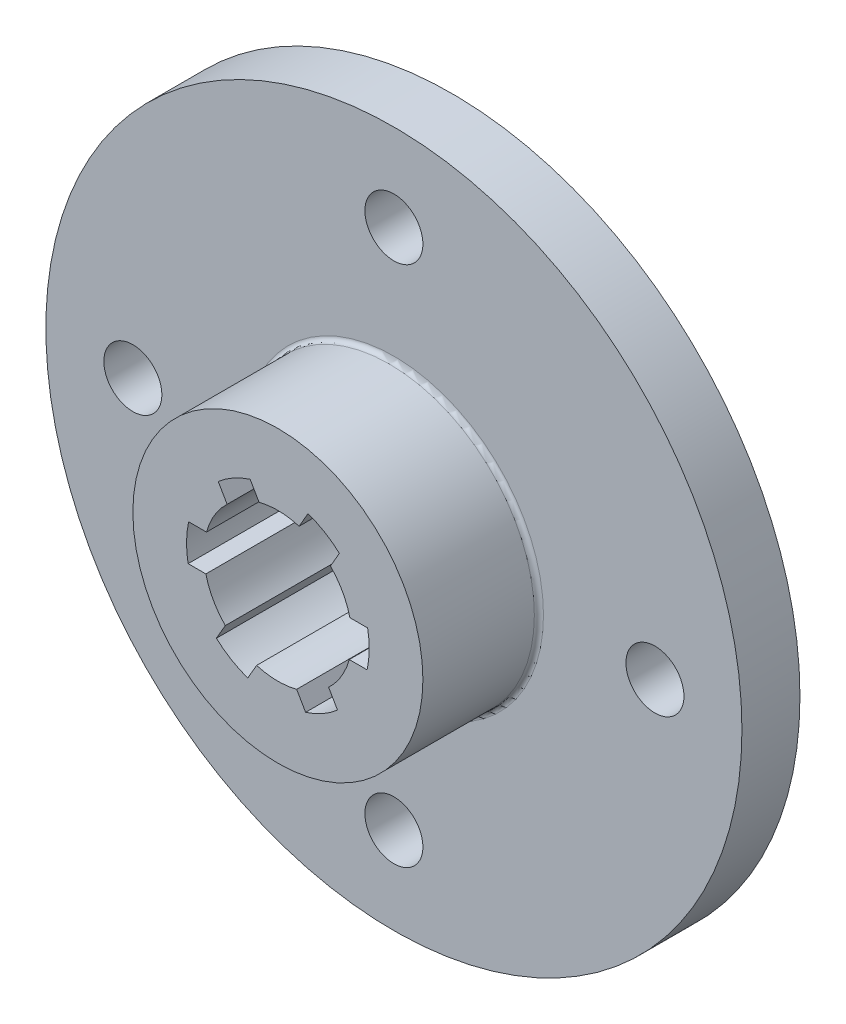
ISO-10303-21;
HEADER;
FILE_DESCRIPTION(('STEP AP214'),'2;1');
FILE_NAME('part.step','',(''),(''),'','','');
FILE_SCHEMA(('AUTOMOTIVE_DESIGN { 1 0 10303 214 1 1 1 1 }'));
ENDSEC;
DATA;
#1=APPLICATION_CONTEXT('core data for automotive mechanical design processes');
#2=APPLICATION_PROTOCOL_DEFINITION('international standard','automotive_design',2000,#1);
#3=PRODUCT_CONTEXT('',#1,'mechanical');
#4=PRODUCT('Part','Part','',(#3));
#5=PRODUCT_RELATED_PRODUCT_CATEGORY('part','',(#4));
#6=PRODUCT_DEFINITION_FORMATION('','',#4);
#7=PRODUCT_DEFINITION_CONTEXT('part definition',#1,'design');
#8=PRODUCT_DEFINITION('design','',#6,#7);
#9=PRODUCT_DEFINITION_SHAPE('','',#8);
#10=(LENGTH_UNIT() NAMED_UNIT(*) SI_UNIT(.MILLI.,.METRE.));
#11=(NAMED_UNIT(*) PLANE_ANGLE_UNIT() SI_UNIT($,.RADIAN.));
#12=(NAMED_UNIT(*) SI_UNIT($,.STERADIAN.) SOLID_ANGLE_UNIT());
#13=UNCERTAINTY_MEASURE_WITH_UNIT(LENGTH_MEASURE(1.E-05),#10,'distance_accuracy_value','');
#14=(GEOMETRIC_REPRESENTATION_CONTEXT(3) GLOBAL_UNCERTAINTY_ASSIGNED_CONTEXT((#13)) GLOBAL_UNIT_ASSIGNED_CONTEXT((#10,
#11,#12)) REPRESENTATION_CONTEXT('',''));
#15=CARTESIAN_POINT('',(0.,0.,0.));
#16=DIRECTION('',(0.,0.,1.));
#17=DIRECTION('',(1.,0.,0.));
#18=AXIS2_PLACEMENT_3D('',#15,#16,#17);
#19=CARTESIAN_POINT('',(0.,0.,3.175));
#20=DIRECTION('',(0.,0.,1.));
#21=DIRECTION('',(1.,0.,0.));
#22=AXIS2_PLACEMENT_3D('',#19,#20,#21);
#23=PLANE('',#22);
#24=CARTESIAN_POINT('',(0.,0.,3.175));
#25=DIRECTION('',(0.,0.,1.));
#26=DIRECTION('',(1.,0.,0.));
#27=AXIS2_PLACEMENT_3D('',#24,#25,#26);
#28=CIRCLE('',#27,16.375);
#29=CARTESIAN_POINT('',(16.375,0.,3.175));
#30=VERTEX_POINT('',#29);
#31=EDGE_CURVE('E11',#30,#30,#28,.F.);
#32=ORIENTED_EDGE('',*,*,#31,.T.);
#33=EDGE_LOOP('',(#32));
#34=FACE_BOUND('',#33,.T.);
#35=CARTESIAN_POINT('',(0.,28.575,3.175));
#36=DIRECTION('',(0.,0.,1.));
#37=DIRECTION('',(1.,0.,0.));
#38=AXIS2_PLACEMENT_3D('',#35,#36,#37);
#39=CIRCLE('',#38,3.17500000000001);
#40=CARTESIAN_POINT('',(3.17500000000001,28.575,3.175));
#41=VERTEX_POINT('',#40);
#42=EDGE_CURVE('E592',#41,#41,#39,.T.);
#43=ORIENTED_EDGE('',*,*,#42,.F.);
#44=EDGE_LOOP('',(#43));
#45=FACE_BOUND('',#44,.T.);
#46=CARTESIAN_POINT('',(28.575,0.,3.175));
#47=DIRECTION('',(0.,0.,1.));
#48=DIRECTION('',(1.,0.,0.));
#49=AXIS2_PLACEMENT_3D('',#46,#47,#48);
#50=CIRCLE('',#49,3.17500000000001);
#51=CARTESIAN_POINT('',(31.75,0.,3.175));
#52=VERTEX_POINT('',#51);
#53=EDGE_CURVE('E600',#52,#52,#50,.T.);
#54=ORIENTED_EDGE('',*,*,#53,.F.);
#55=EDGE_LOOP('',(#54));
#56=FACE_BOUND('',#55,.T.);
#57=CARTESIAN_POINT('',(-28.575,0.,3.175));
#58=DIRECTION('',(0.,0.,1.));
#59=DIRECTION('',(1.,0.,0.));
#60=AXIS2_PLACEMENT_3D('',#57,#58,#59);
#61=CIRCLE('',#60,3.17500000000001);
#62=CARTESIAN_POINT('',(-25.4,0.,3.175));
#63=VERTEX_POINT('',#62);
#64=EDGE_CURVE('E406',#63,#63,#61,.T.);
#65=ORIENTED_EDGE('',*,*,#64,.F.);
#66=EDGE_LOOP('',(#65));
#67=FACE_BOUND('',#66,.T.);
#68=CARTESIAN_POINT('',(0.,-28.575,3.175));
#69=DIRECTION('',(0.,0.,1.));
#70=DIRECTION('',(1.,0.,0.));
#71=AXIS2_PLACEMENT_3D('',#68,#69,#70);
#72=CIRCLE('',#71,3.17500000000001);
#73=CARTESIAN_POINT('',(3.17500000000001,-28.575,3.175));
#74=VERTEX_POINT('',#73);
#75=EDGE_CURVE('E230',#74,#74,#72,.T.);
#76=ORIENTED_EDGE('',*,*,#75,.F.);
#77=EDGE_LOOP('',(#76));
#78=FACE_BOUND('',#77,.T.);
#79=CARTESIAN_POINT('',(0.,0.,3.175));
#80=DIRECTION('',(0.,0.,1.));
#81=DIRECTION('',(1.,0.,0.));
#82=AXIS2_PLACEMENT_3D('',#79,#80,#81);
#83=CIRCLE('',#82,38.1);
#84=CARTESIAN_POINT('',(38.1,0.,3.175));
#85=VERTEX_POINT('',#84);
#86=EDGE_CURVE('E341',#85,#85,#83,.T.);
#87=ORIENTED_EDGE('',*,*,#86,.T.);
#88=EDGE_LOOP('',(#87));
#89=FACE_BOUND('',#88,.T.);
#90=ADVANCED_FACE('F32',(#34,#45,#56,#67,#78,#89),#23,.T.);
#91=CARTESIAN_POINT('',(0.,0.,-3.175));
#92=DIRECTION('',(0.,0.,1.));
#93=DIRECTION('',(1.,0.,0.));
#94=AXIS2_PLACEMENT_3D('',#91,#92,#93);
#95=CYLINDRICAL_SURFACE('',#94,38.1);
#96=CARTESIAN_POINT('',(0.,0.,-3.175));
#97=DIRECTION('',(0.,0.,1.));
#98=DIRECTION('',(1.,0.,0.));
#99=AXIS2_PLACEMENT_3D('',#96,#97,#98);
#100=CIRCLE('',#99,38.1);
#101=CARTESIAN_POINT('',(38.1,0.,-3.175));
#102=VERTEX_POINT('',#101);
#103=EDGE_CURVE('E344',#102,#102,#100,.T.);
#104=ORIENTED_EDGE('',*,*,#103,.T.);
#105=EDGE_LOOP('',(#104));
#106=FACE_BOUND('',#105,.T.);
#107=ORIENTED_EDGE('',*,*,#86,.F.);
#108=EDGE_LOOP('',(#107));
#109=FACE_BOUND('',#108,.T.);
#110=ADVANCED_FACE('F363',(#106,#109),#95,.T.);
#111=CARTESIAN_POINT('',(38.1,0.,-3.175));
#112=DIRECTION('',(0.,0.,-1.));
#113=DIRECTION('',(-1.,0.,0.));
#114=AXIS2_PLACEMENT_3D('',#111,#112,#113);
#115=PLANE('',#114);
#116=CARTESIAN_POINT('',(0.,0.,-3.175));
#117=DIRECTION('',(0.,0.,-1.));
#118=DIRECTION('',(-1.,0.,0.));
#119=AXIS2_PLACEMENT_3D('',#116,#117,#118);
#120=CIRCLE('',#119,4.);
#121=CARTESIAN_POINT('',(-4.,0.,-3.175));
#122=VERTEX_POINT('',#121);
#123=EDGE_CURVE('E384',#122,#122,#120,.T.);
#124=ORIENTED_EDGE('',*,*,#123,.F.);
#125=EDGE_LOOP('',(#124));
#126=FACE_BOUND('',#125,.T.);
#127=CARTESIAN_POINT('',(0.,28.575,-3.175));
#128=DIRECTION('',(0.,0.,-1.));
#129=DIRECTION('',(-1.,0.,0.));
#130=AXIS2_PLACEMENT_3D('',#127,#128,#129);
#131=CIRCLE('',#130,3.17500000000001);
#132=CARTESIAN_POINT('',(-3.17500000000001,28.575,-3.175));
#133=VERTEX_POINT('',#132);
#134=EDGE_CURVE('E388',#133,#133,#131,.T.);
#135=ORIENTED_EDGE('',*,*,#134,.F.);
#136=EDGE_LOOP('',(#135));
#137=FACE_BOUND('',#136,.T.);
#138=CARTESIAN_POINT('',(28.575,0.,-3.175));
#139=DIRECTION('',(0.,0.,-1.));
#140=DIRECTION('',(-1.,0.,0.));
#141=AXIS2_PLACEMENT_3D('',#138,#139,#140);
#142=CIRCLE('',#141,3.17500000000001);
#143=CARTESIAN_POINT('',(25.4,0.,-3.175));
#144=VERTEX_POINT('',#143);
#145=EDGE_CURVE('E392',#144,#144,#142,.T.);
#146=ORIENTED_EDGE('',*,*,#145,.F.);
#147=EDGE_LOOP('',(#146));
#148=FACE_BOUND('',#147,.T.);
#149=CARTESIAN_POINT('',(-28.575,0.,-3.175));
#150=DIRECTION('',(0.,0.,-1.));
#151=DIRECTION('',(-1.,0.,0.));
#152=AXIS2_PLACEMENT_3D('',#149,#150,#151);
#153=CIRCLE('',#152,3.17500000000001);
#154=CARTESIAN_POINT('',(-31.75,0.,-3.175));
#155=VERTEX_POINT('',#154);
#156=EDGE_CURVE('E396',#155,#155,#153,.T.);
#157=ORIENTED_EDGE('',*,*,#156,.F.);
#158=EDGE_LOOP('',(#157));
#159=FACE_BOUND('',#158,.T.);
#160=CARTESIAN_POINT('',(0.,-28.575,-3.175));
#161=DIRECTION('',(0.,0.,-1.));
#162=DIRECTION('',(-1.,0.,0.));
#163=AXIS2_PLACEMENT_3D('',#160,#161,#162);
#164=CIRCLE('',#163,3.17500000000001);
#165=CARTESIAN_POINT('',(-3.17500000000001,-28.575,-3.175));
#166=VERTEX_POINT('',#165);
#167=EDGE_CURVE('E400',#166,#166,#164,.T.);
#168=ORIENTED_EDGE('',*,*,#167,.F.);
#169=EDGE_LOOP('',(#168));
#170=FACE_BOUND('',#169,.T.);
#171=ORIENTED_EDGE('',*,*,#103,.F.);
#172=EDGE_LOOP('',(#171));
#173=FACE_BOUND('',#172,.T.);
#174=ADVANCED_FACE('F369',(#126,#137,#148,#159,#170,#173),#115,.T.);
#175=CARTESIAN_POINT('',(0.,0.,15.875));
#176=DIRECTION('',(0.,0.,-1.));
#177=DIRECTION('',(-1.,0.,0.));
#178=AXIS2_PLACEMENT_3D('',#175,#176,#177);
#179=CYLINDRICAL_SURFACE('',#178,15.875);
#180=CARTESIAN_POINT('',(0.,0.,3.675));
#181=DIRECTION('',(0.,0.,1.));
#182=DIRECTION('',(1.,0.,0.));
#183=AXIS2_PLACEMENT_3D('',#180,#181,#182);
#184=CIRCLE('',#183,15.875);
#185=CARTESIAN_POINT('',(15.875,0.,3.675));
#186=VERTEX_POINT('',#185);
#187=EDGE_CURVE('E40',#186,#186,#184,.T.);
#188=ORIENTED_EDGE('',*,*,#187,.T.);
#189=EDGE_LOOP('',(#188));
#190=FACE_BOUND('',#189,.T.);
#191=CARTESIAN_POINT('',(0.,0.,15.875));
#192=DIRECTION('',(0.,0.,1.));
#193=DIRECTION('',(1.,0.,0.));
#194=AXIS2_PLACEMENT_3D('',#191,#192,#193);
#195=CIRCLE('',#194,15.875);
#196=CARTESIAN_POINT('',(15.875,0.,15.875));
#197=VERTEX_POINT('',#196);
#198=EDGE_CURVE('E297',#197,#197,#195,.T.);
#199=ORIENTED_EDGE('',*,*,#198,.F.);
#200=EDGE_LOOP('',(#199));
#201=FACE_BOUND('',#200,.T.);
#202=ADVANCED_FACE('F349',(#190,#201),#179,.T.);
#203=CARTESIAN_POINT('',(0.,0.,15.875));
#204=DIRECTION('',(0.,0.,1.));
#205=DIRECTION('',(1.,0.,0.));
#206=AXIS2_PLACEMENT_3D('',#203,#204,#205);
#207=PLANE('',#206);
#208=CARTESIAN_POINT('',(0.,0.,15.875));
#209=DIRECTION('',(0.,0.,1.));
#210=DIRECTION('',(1.,0.,0.));
#211=AXIS2_PLACEMENT_3D('',#208,#209,#210);
#212=CIRCLE('',#211,8.10000000000001);
#213=CARTESIAN_POINT('',(-5.55643798834191,5.89372521260629,15.875));
#214=VERTEX_POINT('',#213);
#215=CARTESIAN_POINT('',(-7.81360556333684,2.13484615384614,15.875));
#216=VERTEX_POINT('',#215);
#217=EDGE_CURVE('E47',#214,#216,#212,.T.);
#218=ORIENTED_EDGE('',*,*,#217,.F.);
#219=DIRECTION('',(0.499999999999999,-0.866025403784439,0.));
#220=VECTOR('',#219,1.);
#221=CARTESIAN_POINT('',(-6.52753081375745,7.57570732509163,15.875));
#222=LINE('',#221,#220);
#223=CARTESIAN_POINT('',(-6.52753081375745,7.57570732509163,15.875));
#224=VERTEX_POINT('',#223);
#225=EDGE_CURVE('E293',#224,#214,#222,.T.);
#226=ORIENTED_EDGE('',*,*,#225,.F.);
#227=CARTESIAN_POINT('',(0.,0.,15.875));
#228=DIRECTION('',(0.,0.,1.));
#229=DIRECTION('',(1.,0.,0.));
#230=AXIS2_PLACEMENT_3D('',#227,#228,#229);
#231=CIRCLE('',#230,10.);
#232=CARTESIAN_POINT('',(-3.03590112688098,9.52802730620578,15.875));
#233=VERTEX_POINT('',#232);
#234=EDGE_CURVE('E291',#233,#224,#231,.T.);
#235=ORIENTED_EDGE('',*,*,#234,.F.);
#236=DIRECTION('',(-0.499999999999998,0.86602540378444,0.));
#237=VECTOR('',#236,1.);
#238=CARTESIAN_POINT('',(-2.05797177926615,7.83420398992419,15.875));
#239=LINE('',#238,#237);
#240=CARTESIAN_POINT('',(-2.05797177926615,7.83420398992419,15.875));
#241=VERTEX_POINT('',#240);
#242=EDGE_CURVE('E203',#241,#233,#239,.T.);
#243=ORIENTED_EDGE('',*,*,#242,.F.);
#244=CARTESIAN_POINT('',(0.,0.,15.875));
#245=DIRECTION('',(0.,0.,1.));
#246=DIRECTION('',(1.,0.,0.));
#247=AXIS2_PLACEMENT_3D('',#244,#245,#246);
#248=CIRCLE('',#247,8.10000000000001);
#249=CARTESIAN_POINT('',(2.32589676287095,7.75887905876014,15.875));
#250=VERTEX_POINT('',#249);
#251=EDGE_CURVE('E287',#250,#241,#248,.T.);
#252=ORIENTED_EDGE('',*,*,#251,.F.);
#253=DIRECTION('',(-0.499999999999993,-0.866025403784443,0.));
#254=VECTOR('',#253,1.);
#255=CARTESIAN_POINT('',(3.29698958828648,9.44086117124549,15.875));
#256=LINE('',#255,#254);
#257=CARTESIAN_POINT('',(3.29698958828648,9.44086117124549,15.875));
#258=VERTEX_POINT('',#257);
#259=EDGE_CURVE('E284',#258,#250,#256,.T.);
#260=ORIENTED_EDGE('',*,*,#259,.F.);
#261=CARTESIAN_POINT('',(0.,0.,15.875));
#262=DIRECTION('',(0.,0.,1.));
#263=DIRECTION('',(1.,0.,0.));
#264=AXIS2_PLACEMENT_3D('',#261,#262,#263);
#265=CIRCLE('',#264,10.);
#266=CARTESIAN_POINT('',(6.73356313168554,7.39318115235961,15.875));
#267=VERTEX_POINT('',#266);
#268=EDGE_CURVE('E281',#267,#258,#265,.T.);
#269=ORIENTED_EDGE('',*,*,#268,.F.);
#270=DIRECTION('',(0.500000000000004,0.866025403784436,0.));
#271=VECTOR('',#270,1.);
#272=CARTESIAN_POINT('',(5.7556337840707,5.69935783607804,15.875));
#273=LINE('',#272,#271);
#274=CARTESIAN_POINT('',(5.7556337840707,5.69935783607804,15.875));
#275=VERTEX_POINT('',#274);
#276=EDGE_CURVE('E278',#275,#267,#273,.T.);
#277=ORIENTED_EDGE('',*,*,#276,.F.);
#278=CARTESIAN_POINT('',(0.,0.,15.875));
#279=DIRECTION('',(0.,0.,1.));
#280=DIRECTION('',(1.,0.,0.));
#281=AXIS2_PLACEMENT_3D('',#278,#279,#280);
#282=CIRCLE('',#281,8.10000000000001);
#283=CARTESIAN_POINT('',(7.88233475121285,1.86515384615383,15.875));
#284=VERTEX_POINT('',#283);
#285=EDGE_CURVE('E275',#284,#275,#282,.T.);
#286=ORIENTED_EDGE('',*,*,#285,.F.);
#287=DIRECTION('',(-1.,0.,0.));
#288=VECTOR('',#287,1.);
#289=CARTESIAN_POINT('',(9.82452040204394,1.86515384615383,15.875));
#290=LINE('',#289,#288);
#291=CARTESIAN_POINT('',(9.82452040204394,1.86515384615383,15.875));
#292=VERTEX_POINT('',#291);
#293=EDGE_CURVE('E272',#292,#284,#290,.T.);
#294=ORIENTED_EDGE('',*,*,#293,.F.);
#295=CARTESIAN_POINT('',(0.,0.,15.875));
#296=DIRECTION('',(0.,0.,1.));
#297=DIRECTION('',(1.,0.,0.));
#298=AXIS2_PLACEMENT_3D('',#295,#296,#297);
#299=CIRCLE('',#298,10.);
#300=CARTESIAN_POINT('',(9.7694642585665,-2.13484615384616,15.875));
#301=VERTEX_POINT('',#300);
#302=EDGE_CURVE('E269',#301,#292,#299,.T.);
#303=ORIENTED_EDGE('',*,*,#302,.F.);
#304=DIRECTION('',(1.,0.,0.));
#305=VECTOR('',#304,1.);
#306=CARTESIAN_POINT('',(7.81360556333685,-2.13484615384614,15.875));
#307=LINE('',#306,#305);
#308=CARTESIAN_POINT('',(7.81360556333685,-2.13484615384614,15.875));
#309=VERTEX_POINT('',#308);
#310=EDGE_CURVE('E266',#309,#301,#307,.T.);
#311=ORIENTED_EDGE('',*,*,#310,.F.);
#312=CARTESIAN_POINT('',(0.,0.,15.875));
#313=DIRECTION('',(0.,0.,1.));
#314=DIRECTION('',(1.,0.,0.));
#315=AXIS2_PLACEMENT_3D('',#312,#313,#314);
#316=CIRCLE('',#315,8.10000000000001);
#317=CARTESIAN_POINT('',(5.55643798834191,-5.8937252126063,15.875));
#318=VERTEX_POINT('',#317);
#319=EDGE_CURVE('E263',#318,#309,#316,.T.);
#320=ORIENTED_EDGE('',*,*,#319,.F.);
#321=DIRECTION('',(-0.499999999999999,0.866025403784439,0.));
#322=VECTOR('',#321,1.);
#323=CARTESIAN_POINT('',(6.52753081375745,-7.57570732509163,15.875));
#324=LINE('',#323,#322);
#325=CARTESIAN_POINT('',(6.52753081375745,-7.57570732509163,15.875));
#326=VERTEX_POINT('',#325);
#327=EDGE_CURVE('E260',#326,#318,#324,.T.);
#328=ORIENTED_EDGE('',*,*,#327,.F.);
#329=CARTESIAN_POINT('',(0.,0.,15.875));
#330=DIRECTION('',(0.,0.,1.));
#331=DIRECTION('',(1.,0.,0.));
#332=AXIS2_PLACEMENT_3D('',#329,#330,#331);
#333=CIRCLE('',#332,10.);
#334=CARTESIAN_POINT('',(3.03590112688098,-9.52802730620577,15.875));
#335=VERTEX_POINT('',#334);
#336=EDGE_CURVE('E257',#335,#326,#333,.T.);
#337=ORIENTED_EDGE('',*,*,#336,.F.);
#338=DIRECTION('',(0.5,-0.866025403784439,0.));
#339=VECTOR('',#338,1.);
#340=CARTESIAN_POINT('',(2.05797177926615,-7.83420398992419,15.875));
#341=LINE('',#340,#339);
#342=CARTESIAN_POINT('',(2.05797177926615,-7.83420398992419,15.875));
#343=VERTEX_POINT('',#342);
#344=EDGE_CURVE('E254',#343,#335,#341,.T.);
#345=ORIENTED_EDGE('',*,*,#344,.F.);
#346=CARTESIAN_POINT('',(0.,0.,15.875));
#347=DIRECTION('',(0.,0.,1.));
#348=DIRECTION('',(1.,0.,0.));
#349=AXIS2_PLACEMENT_3D('',#346,#347,#348);
#350=CIRCLE('',#349,8.1);
#351=CARTESIAN_POINT('',(-2.32589676287095,-7.75887905876013,15.875));
#352=VERTEX_POINT('',#351);
#353=EDGE_CURVE('E251',#352,#343,#350,.T.);
#354=ORIENTED_EDGE('',*,*,#353,.F.);
#355=DIRECTION('',(0.499999999999993,0.866025403784443,0.));
#356=VECTOR('',#355,1.);
#357=CARTESIAN_POINT('',(-3.29698958828648,-9.44086117124549,15.875));
#358=LINE('',#357,#356);
#359=CARTESIAN_POINT('',(-3.29698958828648,-9.44086117124549,15.875));
#360=VERTEX_POINT('',#359);
#361=EDGE_CURVE('E248',#360,#352,#358,.T.);
#362=ORIENTED_EDGE('',*,*,#361,.F.);
#363=CARTESIAN_POINT('',(0.,0.,15.875));
#364=DIRECTION('',(0.,0.,1.));
#365=DIRECTION('',(1.,0.,0.));
#366=AXIS2_PLACEMENT_3D('',#363,#364,#365);
#367=CIRCLE('',#366,10.);
#368=CARTESIAN_POINT('',(-6.73356313168552,-7.39318115235962,15.875));
#369=VERTEX_POINT('',#368);
#370=EDGE_CURVE('E245',#369,#360,#367,.T.);
#371=ORIENTED_EDGE('',*,*,#370,.F.);
#372=DIRECTION('',(-0.500000000000005,-0.866025403784436,0.));
#373=VECTOR('',#372,1.);
#374=CARTESIAN_POINT('',(-5.75563378407068,-5.69935783607805,15.875));
#375=LINE('',#374,#373);
#376=CARTESIAN_POINT('',(-5.75563378407068,-5.69935783607805,15.875));
#377=VERTEX_POINT('',#376);
#378=EDGE_CURVE('E242',#377,#369,#375,.T.);
#379=ORIENTED_EDGE('',*,*,#378,.F.);
#380=CARTESIAN_POINT('',(0.,0.,15.875));
#381=DIRECTION('',(0.,0.,1.));
#382=DIRECTION('',(1.,0.,0.));
#383=AXIS2_PLACEMENT_3D('',#380,#381,#382);
#384=CIRCLE('',#383,8.10000000000001);
#385=CARTESIAN_POINT('',(-7.88233475121284,-1.86515384615386,15.875));
#386=VERTEX_POINT('',#385);
#387=EDGE_CURVE('E239',#386,#377,#384,.T.);
#388=ORIENTED_EDGE('',*,*,#387,.F.);
#389=DIRECTION('',(1.,0.,0.));
#390=VECTOR('',#389,1.);
#391=CARTESIAN_POINT('',(-9.82452040204393,-1.86515384615386,15.875));
#392=LINE('',#391,#390);
#393=CARTESIAN_POINT('',(-9.82452040204393,-1.86515384615386,15.875));
#394=VERTEX_POINT('',#393);
#395=EDGE_CURVE('E236',#394,#386,#392,.T.);
#396=ORIENTED_EDGE('',*,*,#395,.F.);
#397=CARTESIAN_POINT('',(0.,0.,15.875));
#398=DIRECTION('',(0.,0.,1.));
#399=DIRECTION('',(1.,0.,0.));
#400=AXIS2_PLACEMENT_3D('',#397,#398,#399);
#401=CIRCLE('',#400,10.);
#402=CARTESIAN_POINT('',(-9.76946425856651,2.13484615384614,15.875));
#403=VERTEX_POINT('',#402);
#404=EDGE_CURVE('E233',#403,#394,#401,.T.);
#405=ORIENTED_EDGE('',*,*,#404,.F.);
#406=DIRECTION('',(-1.,0.,0.));
#407=VECTOR('',#406,1.);
#408=CARTESIAN_POINT('',(-7.81360556333684,2.13484615384614,15.875));
#409=LINE('',#408,#407);
#410=EDGE_CURVE('E229',#216,#403,#409,.T.);
#411=ORIENTED_EDGE('',*,*,#410,.F.);
#412=EDGE_LOOP('',(#218,#226,#235,#243,#252,#260,#269,#277,#286,#294,#303,#311,#320,#328,#337,
#345,#354,#362,#371,#379,#388,#396,#405,#411));
#413=FACE_BOUND('',#412,.T.);
#414=ORIENTED_EDGE('',*,*,#198,.T.);
#415=EDGE_LOOP('',(#414));
#416=FACE_BOUND('',#415,.T.);
#417=ADVANCED_FACE('F380',(#413,#416),#207,.T.);
#418=CARTESIAN_POINT('',(0.,0.,0.889000000000001));
#419=DIRECTION('',(0.,0.,1.));
#420=DIRECTION('',(1.,0.,0.));
#421=AXIS2_PLACEMENT_3D('',#418,#419,#420);
#422=CYLINDRICAL_SURFACE('',#421,8.10000000000001);
#423=ORIENTED_EDGE('',*,*,#217,.T.);
#424=DIRECTION('',(0.,0.,1.));
#425=VECTOR('',#424,1.);
#426=CARTESIAN_POINT('',(-7.81360556333684,2.13484615384614,0.889000000000001));
#427=LINE('',#426,#425);
#428=CARTESIAN_POINT('',(-7.81360556333684,2.13484615384614,0.889000000000001));
#429=VERTEX_POINT('',#428);
#430=EDGE_CURVE('E131',#429,#216,#427,.T.);
#431=ORIENTED_EDGE('',*,*,#430,.F.);
#432=CARTESIAN_POINT('',(0.,0.,0.889000000000001));
#433=DIRECTION('',(0.,0.,1.));
#434=DIRECTION('',(1.,0.,0.));
#435=AXIS2_PLACEMENT_3D('',#432,#433,#434);
#436=CIRCLE('',#435,8.10000000000001);
#437=CARTESIAN_POINT('',(-5.55643798834191,5.89372521260629,0.889000000000001));
#438=VERTEX_POINT('',#437);
#439=EDGE_CURVE('E295',#438,#429,#436,.T.);
#440=ORIENTED_EDGE('',*,*,#439,.F.);
#441=DIRECTION('',(0.,0.,1.));
#442=VECTOR('',#441,1.);
#443=CARTESIAN_POINT('',(-5.55643798834191,5.89372521260629,0.889000000000001));
#444=LINE('',#443,#442);
#445=EDGE_CURVE('E55',#438,#214,#444,.T.);
#446=ORIENTED_EDGE('',*,*,#445,.T.);
#447=EDGE_LOOP('',(#423,#431,#440,#446));
#448=FACE_BOUND('',#447,.T.);
#449=ADVANCED_FACE('F481',(#448),#422,.F.);
#450=CARTESIAN_POINT('',(-6.52753081375745,7.57570732509163,0.889000000000001));
#451=DIRECTION('',(-0.866025403784439,-0.499999999999999,0.));
#452=DIRECTION('',(0.499999999999999,-0.866025403784439,0.));
#453=AXIS2_PLACEMENT_3D('',#450,#451,#452);
#454=PLANE('',#453);
#455=ORIENTED_EDGE('',*,*,#225,.T.);
#456=ORIENTED_EDGE('',*,*,#445,.F.);
#457=DIRECTION('',(0.499999999999999,-0.866025403784439,0.));
#458=VECTOR('',#457,1.);
#459=CARTESIAN_POINT('',(-6.52753081375745,7.57570732509163,0.889000000000001));
#460=LINE('',#459,#458);
#461=CARTESIAN_POINT('',(-6.52753081375745,7.57570732509163,0.889000000000001));
#462=VERTEX_POINT('',#461);
#463=EDGE_CURVE('E215',#462,#438,#460,.T.);
#464=ORIENTED_EDGE('',*,*,#463,.F.);
#465=DIRECTION('',(0.,0.,1.));
#466=VECTOR('',#465,1.);
#467=CARTESIAN_POINT('',(-6.52753081375745,7.57570732509163,0.889000000000001));
#468=LINE('',#467,#466);
#469=EDGE_CURVE('E207',#462,#224,#468,.T.);
#470=ORIENTED_EDGE('',*,*,#469,.T.);
#471=EDGE_LOOP('',(#455,#456,#464,#470));
#472=FACE_BOUND('',#471,.T.);
#473=ADVANCED_FACE('F480',(#472),#454,.F.);
#474=CARTESIAN_POINT('',(0.,0.,0.889000000000001));
#475=DIRECTION('',(0.,0.,1.));
#476=DIRECTION('',(1.,0.,0.));
#477=AXIS2_PLACEMENT_3D('',#474,#475,#476);
#478=CYLINDRICAL_SURFACE('',#477,10.);
#479=ORIENTED_EDGE('',*,*,#234,.T.);
#480=ORIENTED_EDGE('',*,*,#469,.F.);
#481=CARTESIAN_POINT('',(0.,0.,0.889000000000001));
#482=DIRECTION('',(0.,0.,1.));
#483=DIRECTION('',(1.,0.,0.));
#484=AXIS2_PLACEMENT_3D('',#481,#482,#483);
#485=CIRCLE('',#484,10.);
#486=CARTESIAN_POINT('',(-3.03590112688098,9.52802730620578,0.889000000000001));
#487=VERTEX_POINT('',#486);
#488=EDGE_CURVE('E211',#487,#462,#485,.T.);
#489=ORIENTED_EDGE('',*,*,#488,.F.);
#490=DIRECTION('',(0.,0.,1.));
#491=VECTOR('',#490,1.);
#492=CARTESIAN_POINT('',(-3.03590112688098,9.52802730620578,0.889000000000001));
#493=LINE('',#492,#491);
#494=EDGE_CURVE('E196',#487,#233,#493,.T.);
#495=ORIENTED_EDGE('',*,*,#494,.T.);
#496=EDGE_LOOP('',(#479,#480,#489,#495));
#497=FACE_BOUND('',#496,.T.);
#498=ADVANCED_FACE('F212',(#497),#478,.F.);
#499=CARTESIAN_POINT('',(-2.05797177926615,7.83420398992419,0.889000000000001));
#500=DIRECTION('',(0.86602540378444,0.499999999999998,0.));
#501=DIRECTION('',(-0.499999999999998,0.86602540378444,0.));
#502=AXIS2_PLACEMENT_3D('',#499,#500,#501);
#503=PLANE('',#502);
#504=ORIENTED_EDGE('',*,*,#242,.T.);
#505=ORIENTED_EDGE('',*,*,#494,.F.);
#506=DIRECTION('',(-0.499999999999998,0.86602540378444,0.));
#507=VECTOR('',#506,1.);
#508=CARTESIAN_POINT('',(-2.05797177926615,7.83420398992419,0.889000000000001));
#509=LINE('',#508,#507);
#510=CARTESIAN_POINT('',(-2.05797177926615,7.83420398992419,0.889000000000001));
#511=VERTEX_POINT('',#510);
#512=EDGE_CURVE('E200',#511,#487,#509,.T.);
#513=ORIENTED_EDGE('',*,*,#512,.F.);
#514=DIRECTION('',(0.,0.,1.));
#515=VECTOR('',#514,1.);
#516=CARTESIAN_POINT('',(-2.05797177926615,7.83420398992419,0.889000000000001));
#517=LINE('',#516,#515);
#518=EDGE_CURVE('E208',#511,#241,#517,.T.);
#519=ORIENTED_EDGE('',*,*,#518,.T.);
#520=EDGE_LOOP('',(#504,#505,#513,#519));
#521=FACE_BOUND('',#520,.T.);
#522=ADVANCED_FACE('F198',(#521),#503,.F.);
#523=CARTESIAN_POINT('',(0.,0.,0.889000000000001));
#524=DIRECTION('',(0.,0.,1.));
#525=DIRECTION('',(1.,0.,0.));
#526=AXIS2_PLACEMENT_3D('',#523,#524,#525);
#527=CYLINDRICAL_SURFACE('',#526,8.10000000000001);
#528=ORIENTED_EDGE('',*,*,#251,.T.);
#529=ORIENTED_EDGE('',*,*,#518,.F.);
#530=CARTESIAN_POINT('',(0.,0.,0.889000000000001));
#531=DIRECTION('',(0.,0.,1.));
#532=DIRECTION('',(1.,0.,0.));
#533=AXIS2_PLACEMENT_3D('',#530,#531,#532);
#534=CIRCLE('',#533,8.10000000000001);
#535=CARTESIAN_POINT('',(2.32589676287095,7.75887905876014,0.889000000000001));
#536=VERTEX_POINT('',#535);
#537=EDGE_CURVE('E221',#536,#511,#534,.T.);
#538=ORIENTED_EDGE('',*,*,#537,.F.);
#539=DIRECTION('',(0.,0.,1.));
#540=VECTOR('',#539,1.);
#541=CARTESIAN_POINT('',(2.32589676287095,7.75887905876014,0.889000000000001));
#542=LINE('',#541,#540);
#543=EDGE_CURVE('E300',#536,#250,#542,.T.);
#544=ORIENTED_EDGE('',*,*,#543,.T.);
#545=EDGE_LOOP('',(#528,#529,#538,#544));
#546=FACE_BOUND('',#545,.T.);
#547=ADVANCED_FACE('F475',(#546),#527,.F.);
#548=CARTESIAN_POINT('',(3.29698958828648,9.44086117124549,0.889000000000001));
#549=DIRECTION('',(-0.866025403784443,0.499999999999993,0.));
#550=DIRECTION('',(-0.499999999999993,-0.866025403784443,0.));
#551=AXIS2_PLACEMENT_3D('',#548,#549,#550);
#552=PLANE('',#551);
#553=ORIENTED_EDGE('',*,*,#259,.T.);
#554=ORIENTED_EDGE('',*,*,#543,.F.);
#555=DIRECTION('',(-0.499999999999993,-0.866025403784443,0.));
#556=VECTOR('',#555,1.);
#557=CARTESIAN_POINT('',(3.29698958828648,9.44086117124549,0.889000000000001));
#558=LINE('',#557,#556);
#559=CARTESIAN_POINT('',(3.29698958828648,9.44086117124549,0.889000000000001));
#560=VERTEX_POINT('',#559);
#561=EDGE_CURVE('E223',#560,#536,#558,.T.);
#562=ORIENTED_EDGE('',*,*,#561,.F.);
#563=DIRECTION('',(0.,0.,1.));
#564=VECTOR('',#563,1.);
#565=CARTESIAN_POINT('',(3.29698958828648,9.44086117124549,0.889000000000001));
#566=LINE('',#565,#564);
#567=EDGE_CURVE('E302',#560,#258,#566,.T.);
#568=ORIENTED_EDGE('',*,*,#567,.T.);
#569=EDGE_LOOP('',(#553,#554,#562,#568));
#570=FACE_BOUND('',#569,.T.);
#571=ADVANCED_FACE('F471',(#570),#552,.F.);
#572=CARTESIAN_POINT('',(0.,0.,0.889000000000001));
#573=DIRECTION('',(0.,0.,1.));
#574=DIRECTION('',(1.,0.,0.));
#575=AXIS2_PLACEMENT_3D('',#572,#573,#574);
#576=CYLINDRICAL_SURFACE('',#575,10.);
#577=ORIENTED_EDGE('',*,*,#268,.T.);
#578=ORIENTED_EDGE('',*,*,#567,.F.);
#579=CARTESIAN_POINT('',(0.,0.,0.889000000000001));
#580=DIRECTION('',(0.,0.,1.));
#581=DIRECTION('',(1.,0.,0.));
#582=AXIS2_PLACEMENT_3D('',#579,#580,#581);
#583=CIRCLE('',#582,10.);
#584=CARTESIAN_POINT('',(6.73356313168554,7.39318115235961,0.889000000000001));
#585=VERTEX_POINT('',#584);
#586=EDGE_CURVE('E466',#585,#560,#583,.T.);
#587=ORIENTED_EDGE('',*,*,#586,.F.);
#588=DIRECTION('',(0.,0.,1.));
#589=VECTOR('',#588,1.);
#590=CARTESIAN_POINT('',(6.73356313168554,7.39318115235961,0.889000000000001));
#591=LINE('',#590,#589);
#592=EDGE_CURVE('E304',#585,#267,#591,.T.);
#593=ORIENTED_EDGE('',*,*,#592,.T.);
#594=EDGE_LOOP('',(#577,#578,#587,#593));
#595=FACE_BOUND('',#594,.T.);
#596=ADVANCED_FACE('F557',(#595),#576,.F.);
#597=CARTESIAN_POINT('',(5.7556337840707,5.69935783607804,0.889000000000001));
#598=DIRECTION('',(0.866025403784436,-0.500000000000004,0.));
#599=DIRECTION('',(0.500000000000004,0.866025403784436,0.));
#600=AXIS2_PLACEMENT_3D('',#597,#598,#599);
#601=PLANE('',#600);
#602=ORIENTED_EDGE('',*,*,#276,.T.);
#603=ORIENTED_EDGE('',*,*,#592,.F.);
#604=DIRECTION('',(0.500000000000004,0.866025403784436,0.));
#605=VECTOR('',#604,1.);
#606=CARTESIAN_POINT('',(5.7556337840707,5.69935783607804,0.889000000000001));
#607=LINE('',#606,#605);
#608=CARTESIAN_POINT('',(5.7556337840707,5.69935783607804,0.889000000000001));
#609=VERTEX_POINT('',#608);
#610=EDGE_CURVE('E463',#609,#585,#607,.T.);
#611=ORIENTED_EDGE('',*,*,#610,.F.);
#612=DIRECTION('',(0.,0.,1.));
#613=VECTOR('',#612,1.);
#614=CARTESIAN_POINT('',(5.7556337840707,5.69935783607804,0.889000000000001));
#615=LINE('',#614,#613);
#616=EDGE_CURVE('E306',#609,#275,#615,.T.);
#617=ORIENTED_EDGE('',*,*,#616,.T.);
#618=EDGE_LOOP('',(#602,#603,#611,#617));
#619=FACE_BOUND('',#618,.T.);
#620=ADVANCED_FACE('F553',(#619),#601,.F.);
#621=CARTESIAN_POINT('',(0.,0.,0.889000000000001));
#622=DIRECTION('',(0.,0.,1.));
#623=DIRECTION('',(1.,0.,0.));
#624=AXIS2_PLACEMENT_3D('',#621,#622,#623);
#625=CYLINDRICAL_SURFACE('',#624,8.10000000000001);
#626=ORIENTED_EDGE('',*,*,#285,.T.);
#627=ORIENTED_EDGE('',*,*,#616,.F.);
#628=CARTESIAN_POINT('',(0.,0.,0.889000000000001));
#629=DIRECTION('',(0.,0.,1.));
#630=DIRECTION('',(1.,0.,0.));
#631=AXIS2_PLACEMENT_3D('',#628,#629,#630);
#632=CIRCLE('',#631,8.10000000000001);
#633=CARTESIAN_POINT('',(7.88233475121285,1.86515384615383,0.889000000000001));
#634=VERTEX_POINT('',#633);
#635=EDGE_CURVE('E460',#634,#609,#632,.T.);
#636=ORIENTED_EDGE('',*,*,#635,.F.);
#637=DIRECTION('',(0.,0.,1.));
#638=VECTOR('',#637,1.);
#639=CARTESIAN_POINT('',(7.88233475121285,1.86515384615383,0.889000000000001));
#640=LINE('',#639,#638);
#641=EDGE_CURVE('E308',#634,#284,#640,.T.);
#642=ORIENTED_EDGE('',*,*,#641,.T.);
#643=EDGE_LOOP('',(#626,#627,#636,#642));
#644=FACE_BOUND('',#643,.T.);
#645=ADVANCED_FACE('F549',(#644),#625,.F.);
#646=CARTESIAN_POINT('',(9.82452040204394,1.86515384615383,0.889000000000001));
#647=DIRECTION('',(0.,1.,0.));
#648=DIRECTION('',(0.,0.,1.));
#649=AXIS2_PLACEMENT_3D('',#646,#647,#648);
#650=PLANE('',#649);
#651=ORIENTED_EDGE('',*,*,#293,.T.);
#652=ORIENTED_EDGE('',*,*,#641,.F.);
#653=DIRECTION('',(-1.,0.,0.));
#654=VECTOR('',#653,1.);
#655=CARTESIAN_POINT('',(9.82452040204394,1.86515384615383,0.889000000000001));
#656=LINE('',#655,#654);
#657=CARTESIAN_POINT('',(9.82452040204394,1.86515384615383,0.889000000000001));
#658=VERTEX_POINT('',#657);
#659=EDGE_CURVE('E457',#658,#634,#656,.T.);
#660=ORIENTED_EDGE('',*,*,#659,.F.);
#661=DIRECTION('',(0.,0.,1.));
#662=VECTOR('',#661,1.);
#663=CARTESIAN_POINT('',(9.82452040204394,1.86515384615383,0.889000000000001));
#664=LINE('',#663,#662);
#665=EDGE_CURVE('E310',#658,#292,#664,.T.);
#666=ORIENTED_EDGE('',*,*,#665,.T.);
#667=EDGE_LOOP('',(#651,#652,#660,#666));
#668=FACE_BOUND('',#667,.T.);
#669=ADVANCED_FACE('F545',(#668),#650,.F.);
#670=CARTESIAN_POINT('',(0.,0.,0.889000000000001));
#671=DIRECTION('',(0.,0.,1.));
#672=DIRECTION('',(1.,0.,0.));
#673=AXIS2_PLACEMENT_3D('',#670,#671,#672);
#674=CYLINDRICAL_SURFACE('',#673,10.);
#675=ORIENTED_EDGE('',*,*,#302,.T.);
#676=ORIENTED_EDGE('',*,*,#665,.F.);
#677=CARTESIAN_POINT('',(0.,0.,0.889000000000001));
#678=DIRECTION('',(0.,0.,1.));
#679=DIRECTION('',(1.,0.,0.));
#680=AXIS2_PLACEMENT_3D('',#677,#678,#679);
#681=CIRCLE('',#680,10.);
#682=CARTESIAN_POINT('',(9.7694642585665,-2.13484615384616,0.889000000000001));
#683=VERTEX_POINT('',#682);
#684=EDGE_CURVE('E454',#683,#658,#681,.T.);
#685=ORIENTED_EDGE('',*,*,#684,.F.);
#686=DIRECTION('',(0.,0.,1.));
#687=VECTOR('',#686,1.);
#688=CARTESIAN_POINT('',(9.7694642585665,-2.13484615384616,0.889000000000001));
#689=LINE('',#688,#687);
#690=EDGE_CURVE('E312',#683,#301,#689,.T.);
#691=ORIENTED_EDGE('',*,*,#690,.T.);
#692=EDGE_LOOP('',(#675,#676,#685,#691));
#693=FACE_BOUND('',#692,.T.);
#694=ADVANCED_FACE('F541',(#693),#674,.F.);
#695=CARTESIAN_POINT('',(7.81360556333685,-2.13484615384614,0.889000000000001));
#696=DIRECTION('',(0.,-1.,0.));
#697=DIRECTION('',(1.,0.,0.));
#698=AXIS2_PLACEMENT_3D('',#695,#696,#697);
#699=PLANE('',#698);
#700=ORIENTED_EDGE('',*,*,#310,.T.);
#701=ORIENTED_EDGE('',*,*,#690,.F.);
#702=DIRECTION('',(1.,0.,0.));
#703=VECTOR('',#702,1.);
#704=CARTESIAN_POINT('',(7.81360556333685,-2.13484615384614,0.889000000000001));
#705=LINE('',#704,#703);
#706=CARTESIAN_POINT('',(7.81360556333685,-2.13484615384614,0.889000000000001));
#707=VERTEX_POINT('',#706);
#708=EDGE_CURVE('E451',#707,#683,#705,.T.);
#709=ORIENTED_EDGE('',*,*,#708,.F.);
#710=DIRECTION('',(0.,0.,1.));
#711=VECTOR('',#710,1.);
#712=CARTESIAN_POINT('',(7.81360556333685,-2.13484615384614,0.889000000000001));
#713=LINE('',#712,#711);
#714=EDGE_CURVE('E314',#707,#309,#713,.T.);
#715=ORIENTED_EDGE('',*,*,#714,.T.);
#716=EDGE_LOOP('',(#700,#701,#709,#715));
#717=FACE_BOUND('',#716,.T.);
#718=ADVANCED_FACE('F537',(#717),#699,.F.);
#719=CARTESIAN_POINT('',(0.,0.,0.889000000000001));
#720=DIRECTION('',(0.,0.,1.));
#721=DIRECTION('',(1.,0.,0.));
#722=AXIS2_PLACEMENT_3D('',#719,#720,#721);
#723=CYLINDRICAL_SURFACE('',#722,8.10000000000001);
#724=ORIENTED_EDGE('',*,*,#319,.T.);
#725=ORIENTED_EDGE('',*,*,#714,.F.);
#726=CARTESIAN_POINT('',(0.,0.,0.889000000000001));
#727=DIRECTION('',(0.,0.,1.));
#728=DIRECTION('',(1.,0.,0.));
#729=AXIS2_PLACEMENT_3D('',#726,#727,#728);
#730=CIRCLE('',#729,8.10000000000001);
#731=CARTESIAN_POINT('',(5.55643798834191,-5.8937252126063,0.889000000000001));
#732=VERTEX_POINT('',#731);
#733=EDGE_CURVE('E448',#732,#707,#730,.T.);
#734=ORIENTED_EDGE('',*,*,#733,.F.);
#735=DIRECTION('',(0.,0.,1.));
#736=VECTOR('',#735,1.);
#737=CARTESIAN_POINT('',(5.55643798834191,-5.8937252126063,0.889000000000001));
#738=LINE('',#737,#736);
#739=EDGE_CURVE('E316',#732,#318,#738,.T.);
#740=ORIENTED_EDGE('',*,*,#739,.T.);
#741=EDGE_LOOP('',(#724,#725,#734,#740));
#742=FACE_BOUND('',#741,.T.);
#743=ADVANCED_FACE('F533',(#742),#723,.F.);
#744=CARTESIAN_POINT('',(6.52753081375745,-7.57570732509163,0.889000000000001));
#745=DIRECTION('',(0.866025403784439,0.499999999999999,0.));
#746=DIRECTION('',(-0.499999999999999,0.866025403784439,0.));
#747=AXIS2_PLACEMENT_3D('',#744,#745,#746);
#748=PLANE('',#747);
#749=ORIENTED_EDGE('',*,*,#327,.T.);
#750=ORIENTED_EDGE('',*,*,#739,.F.);
#751=DIRECTION('',(-0.499999999999999,0.866025403784439,0.));
#752=VECTOR('',#751,1.);
#753=CARTESIAN_POINT('',(6.52753081375745,-7.57570732509163,0.889000000000001));
#754=LINE('',#753,#752);
#755=CARTESIAN_POINT('',(6.52753081375745,-7.57570732509163,0.889000000000001));
#756=VERTEX_POINT('',#755);
#757=EDGE_CURVE('E445',#756,#732,#754,.T.);
#758=ORIENTED_EDGE('',*,*,#757,.F.);
#759=DIRECTION('',(0.,0.,1.));
#760=VECTOR('',#759,1.);
#761=CARTESIAN_POINT('',(6.52753081375745,-7.57570732509163,0.889000000000001));
#762=LINE('',#761,#760);
#763=EDGE_CURVE('E318',#756,#326,#762,.T.);
#764=ORIENTED_EDGE('',*,*,#763,.T.);
#765=EDGE_LOOP('',(#749,#750,#758,#764));
#766=FACE_BOUND('',#765,.T.);
#767=ADVANCED_FACE('F529',(#766),#748,.F.);
#768=CARTESIAN_POINT('',(0.,0.,0.889000000000001));
#769=DIRECTION('',(0.,0.,1.));
#770=DIRECTION('',(1.,0.,0.));
#771=AXIS2_PLACEMENT_3D('',#768,#769,#770);
#772=CYLINDRICAL_SURFACE('',#771,10.);
#773=ORIENTED_EDGE('',*,*,#336,.T.);
#774=ORIENTED_EDGE('',*,*,#763,.F.);
#775=CARTESIAN_POINT('',(0.,0.,0.889000000000001));
#776=DIRECTION('',(0.,0.,1.));
#777=DIRECTION('',(1.,0.,0.));
#778=AXIS2_PLACEMENT_3D('',#775,#776,#777);
#779=CIRCLE('',#778,10.);
#780=CARTESIAN_POINT('',(3.03590112688098,-9.52802730620577,0.889000000000001));
#781=VERTEX_POINT('',#780);
#782=EDGE_CURVE('E442',#781,#756,#779,.T.);
#783=ORIENTED_EDGE('',*,*,#782,.F.);
#784=DIRECTION('',(0.,0.,1.));
#785=VECTOR('',#784,1.);
#786=CARTESIAN_POINT('',(3.03590112688098,-9.52802730620577,0.889000000000001));
#787=LINE('',#786,#785);
#788=EDGE_CURVE('E320',#781,#335,#787,.T.);
#789=ORIENTED_EDGE('',*,*,#788,.T.);
#790=EDGE_LOOP('',(#773,#774,#783,#789));
#791=FACE_BOUND('',#790,.T.);
#792=ADVANCED_FACE('F525',(#791),#772,.F.);
#793=CARTESIAN_POINT('',(2.05797177926615,-7.83420398992419,0.889000000000001));
#794=DIRECTION('',(-0.866025403784439,-0.5,0.));
#795=DIRECTION('',(0.5,-0.866025403784439,0.));
#796=AXIS2_PLACEMENT_3D('',#793,#794,#795);
#797=PLANE('',#796);
#798=ORIENTED_EDGE('',*,*,#344,.T.);
#799=ORIENTED_EDGE('',*,*,#788,.F.);
#800=DIRECTION('',(0.5,-0.866025403784439,0.));
#801=VECTOR('',#800,1.);
#802=CARTESIAN_POINT('',(2.05797177926615,-7.83420398992419,0.889000000000001));
#803=LINE('',#802,#801);
#804=CARTESIAN_POINT('',(2.05797177926615,-7.83420398992419,0.889000000000001));
#805=VERTEX_POINT('',#804);
#806=EDGE_CURVE('E439',#805,#781,#803,.T.);
#807=ORIENTED_EDGE('',*,*,#806,.F.);
#808=DIRECTION('',(0.,0.,1.));
#809=VECTOR('',#808,1.);
#810=CARTESIAN_POINT('',(2.05797177926615,-7.83420398992419,0.889000000000001));
#811=LINE('',#810,#809);
#812=EDGE_CURVE('E322',#805,#343,#811,.T.);
#813=ORIENTED_EDGE('',*,*,#812,.T.);
#814=EDGE_LOOP('',(#798,#799,#807,#813));
#815=FACE_BOUND('',#814,.T.);
#816=ADVANCED_FACE('F521',(#815),#797,.F.);
#817=CARTESIAN_POINT('',(0.,0.,0.889000000000001));
#818=DIRECTION('',(0.,0.,1.));
#819=DIRECTION('',(1.,0.,0.));
#820=AXIS2_PLACEMENT_3D('',#817,#818,#819);
#821=CYLINDRICAL_SURFACE('',#820,8.1);
#822=ORIENTED_EDGE('',*,*,#353,.T.);
#823=ORIENTED_EDGE('',*,*,#812,.F.);
#824=CARTESIAN_POINT('',(0.,0.,0.889000000000001));
#825=DIRECTION('',(0.,0.,1.));
#826=DIRECTION('',(1.,0.,0.));
#827=AXIS2_PLACEMENT_3D('',#824,#825,#826);
#828=CIRCLE('',#827,8.1);
#829=CARTESIAN_POINT('',(-2.32589676287095,-7.75887905876013,0.889000000000001));
#830=VERTEX_POINT('',#829);
#831=EDGE_CURVE('E436',#830,#805,#828,.T.);
#832=ORIENTED_EDGE('',*,*,#831,.F.);
#833=DIRECTION('',(0.,0.,1.));
#834=VECTOR('',#833,1.);
#835=CARTESIAN_POINT('',(-2.32589676287095,-7.75887905876013,0.889000000000001));
#836=LINE('',#835,#834);
#837=EDGE_CURVE('E324',#830,#352,#836,.T.);
#838=ORIENTED_EDGE('',*,*,#837,.T.);
#839=EDGE_LOOP('',(#822,#823,#832,#838));
#840=FACE_BOUND('',#839,.T.);
#841=ADVANCED_FACE('F517',(#840),#821,.F.);
#842=CARTESIAN_POINT('',(-3.29698958828648,-9.44086117124549,0.889000000000001));
#843=DIRECTION('',(0.866025403784443,-0.499999999999993,0.));
#844=DIRECTION('',(0.499999999999993,0.866025403784443,0.));
#845=AXIS2_PLACEMENT_3D('',#842,#843,#844);
#846=PLANE('',#845);
#847=ORIENTED_EDGE('',*,*,#361,.T.);
#848=ORIENTED_EDGE('',*,*,#837,.F.);
#849=DIRECTION('',(0.499999999999993,0.866025403784443,0.));
#850=VECTOR('',#849,1.);
#851=CARTESIAN_POINT('',(-3.29698958828648,-9.44086117124549,0.889000000000001));
#852=LINE('',#851,#850);
#853=CARTESIAN_POINT('',(-3.29698958828648,-9.44086117124549,0.889000000000001));
#854=VERTEX_POINT('',#853);
#855=EDGE_CURVE('E433',#854,#830,#852,.T.);
#856=ORIENTED_EDGE('',*,*,#855,.F.);
#857=DIRECTION('',(0.,0.,1.));
#858=VECTOR('',#857,1.);
#859=CARTESIAN_POINT('',(-3.29698958828648,-9.44086117124549,0.889000000000001));
#860=LINE('',#859,#858);
#861=EDGE_CURVE('E326',#854,#360,#860,.T.);
#862=ORIENTED_EDGE('',*,*,#861,.T.);
#863=EDGE_LOOP('',(#847,#848,#856,#862));
#864=FACE_BOUND('',#863,.T.);
#865=ADVANCED_FACE('F513',(#864),#846,.F.);
#866=CARTESIAN_POINT('',(0.,0.,0.889000000000001));
#867=DIRECTION('',(0.,0.,1.));
#868=DIRECTION('',(1.,0.,0.));
#869=AXIS2_PLACEMENT_3D('',#866,#867,#868);
#870=CYLINDRICAL_SURFACE('',#869,10.);
#871=ORIENTED_EDGE('',*,*,#370,.T.);
#872=ORIENTED_EDGE('',*,*,#861,.F.);
#873=CARTESIAN_POINT('',(0.,0.,0.889000000000001));
#874=DIRECTION('',(0.,0.,1.));
#875=DIRECTION('',(1.,0.,0.));
#876=AXIS2_PLACEMENT_3D('',#873,#874,#875);
#877=CIRCLE('',#876,10.);
#878=CARTESIAN_POINT('',(-6.73356313168552,-7.39318115235962,0.889000000000001));
#879=VERTEX_POINT('',#878);
#880=EDGE_CURVE('E430',#879,#854,#877,.T.);
#881=ORIENTED_EDGE('',*,*,#880,.F.);
#882=DIRECTION('',(0.,0.,1.));
#883=VECTOR('',#882,1.);
#884=CARTESIAN_POINT('',(-6.73356313168552,-7.39318115235962,0.889000000000001));
#885=LINE('',#884,#883);
#886=EDGE_CURVE('E328',#879,#369,#885,.T.);
#887=ORIENTED_EDGE('',*,*,#886,.T.);
#888=EDGE_LOOP('',(#871,#872,#881,#887));
#889=FACE_BOUND('',#888,.T.);
#890=ADVANCED_FACE('F509',(#889),#870,.F.);
#891=CARTESIAN_POINT('',(-5.75563378407068,-5.69935783607805,0.889000000000001));
#892=DIRECTION('',(-0.866025403784436,0.500000000000005,0.));
#893=DIRECTION('',(-0.500000000000005,-0.866025403784436,0.));
#894=AXIS2_PLACEMENT_3D('',#891,#892,#893);
#895=PLANE('',#894);
#896=ORIENTED_EDGE('',*,*,#378,.T.);
#897=ORIENTED_EDGE('',*,*,#886,.F.);
#898=DIRECTION('',(-0.500000000000005,-0.866025403784436,0.));
#899=VECTOR('',#898,1.);
#900=CARTESIAN_POINT('',(-5.75563378407068,-5.69935783607805,0.889000000000001));
#901=LINE('',#900,#899);
#902=CARTESIAN_POINT('',(-5.75563378407068,-5.69935783607805,0.889000000000001));
#903=VERTEX_POINT('',#902);
#904=EDGE_CURVE('E427',#903,#879,#901,.T.);
#905=ORIENTED_EDGE('',*,*,#904,.F.);
#906=DIRECTION('',(0.,0.,1.));
#907=VECTOR('',#906,1.);
#908=CARTESIAN_POINT('',(-5.75563378407068,-5.69935783607805,0.889000000000001));
#909=LINE('',#908,#907);
#910=EDGE_CURVE('E330',#903,#377,#909,.T.);
#911=ORIENTED_EDGE('',*,*,#910,.T.);
#912=EDGE_LOOP('',(#896,#897,#905,#911));
#913=FACE_BOUND('',#912,.T.);
#914=ADVANCED_FACE('F505',(#913),#895,.F.);
#915=CARTESIAN_POINT('',(0.,0.,0.889000000000001));
#916=DIRECTION('',(0.,0.,1.));
#917=DIRECTION('',(1.,0.,0.));
#918=AXIS2_PLACEMENT_3D('',#915,#916,#917);
#919=CYLINDRICAL_SURFACE('',#918,8.10000000000001);
#920=ORIENTED_EDGE('',*,*,#387,.T.);
#921=ORIENTED_EDGE('',*,*,#910,.F.);
#922=CARTESIAN_POINT('',(0.,0.,0.889000000000001));
#923=DIRECTION('',(0.,0.,1.));
#924=DIRECTION('',(1.,0.,0.));
#925=AXIS2_PLACEMENT_3D('',#922,#923,#924);
#926=CIRCLE('',#925,8.10000000000001);
#927=CARTESIAN_POINT('',(-7.88233475121284,-1.86515384615386,0.889000000000001));
#928=VERTEX_POINT('',#927);
#929=EDGE_CURVE('E424',#928,#903,#926,.T.);
#930=ORIENTED_EDGE('',*,*,#929,.F.);
#931=DIRECTION('',(0.,0.,1.));
#932=VECTOR('',#931,1.);
#933=CARTESIAN_POINT('',(-7.88233475121284,-1.86515384615386,0.889000000000001));
#934=LINE('',#933,#932);
#935=EDGE_CURVE('E332',#928,#386,#934,.T.);
#936=ORIENTED_EDGE('',*,*,#935,.T.);
#937=EDGE_LOOP('',(#920,#921,#930,#936));
#938=FACE_BOUND('',#937,.T.);
#939=ADVANCED_FACE('F501',(#938),#919,.F.);
#940=CARTESIAN_POINT('',(-9.82452040204393,-1.86515384615386,0.889000000000001));
#941=DIRECTION('',(0.,-1.,0.));
#942=DIRECTION('',(1.,0.,0.));
#943=AXIS2_PLACEMENT_3D('',#940,#941,#942);
#944=PLANE('',#943);
#945=ORIENTED_EDGE('',*,*,#395,.T.);
#946=ORIENTED_EDGE('',*,*,#935,.F.);
#947=DIRECTION('',(1.,0.,0.));
#948=VECTOR('',#947,1.);
#949=CARTESIAN_POINT('',(-9.82452040204393,-1.86515384615386,0.889000000000001));
#950=LINE('',#949,#948);
#951=CARTESIAN_POINT('',(-9.82452040204393,-1.86515384615386,0.889000000000001));
#952=VERTEX_POINT('',#951);
#953=EDGE_CURVE('E421',#952,#928,#950,.T.);
#954=ORIENTED_EDGE('',*,*,#953,.F.);
#955=DIRECTION('',(0.,0.,1.));
#956=VECTOR('',#955,1.);
#957=CARTESIAN_POINT('',(-9.82452040204393,-1.86515384615386,0.889000000000001));
#958=LINE('',#957,#956);
#959=EDGE_CURVE('E334',#952,#394,#958,.T.);
#960=ORIENTED_EDGE('',*,*,#959,.T.);
#961=EDGE_LOOP('',(#945,#946,#954,#960));
#962=FACE_BOUND('',#961,.T.);
#963=ADVANCED_FACE('F497',(#962),#944,.F.);
#964=CARTESIAN_POINT('',(0.,0.,0.889000000000001));
#965=DIRECTION('',(0.,0.,1.));
#966=DIRECTION('',(1.,0.,0.));
#967=AXIS2_PLACEMENT_3D('',#964,#965,#966);
#968=CYLINDRICAL_SURFACE('',#967,10.);
#969=ORIENTED_EDGE('',*,*,#404,.T.);
#970=ORIENTED_EDGE('',*,*,#959,.F.);
#971=CARTESIAN_POINT('',(0.,0.,0.889000000000001));
#972=DIRECTION('',(0.,0.,1.));
#973=DIRECTION('',(1.,0.,0.));
#974=AXIS2_PLACEMENT_3D('',#971,#972,#973);
#975=CIRCLE('',#974,10.);
#976=CARTESIAN_POINT('',(-9.76946425856651,2.13484615384614,0.889000000000001));
#977=VERTEX_POINT('',#976);
#978=EDGE_CURVE('E418',#977,#952,#975,.T.);
#979=ORIENTED_EDGE('',*,*,#978,.F.);
#980=DIRECTION('',(0.,0.,1.));
#981=VECTOR('',#980,1.);
#982=CARTESIAN_POINT('',(-9.76946425856651,2.13484615384614,0.889000000000001));
#983=LINE('',#982,#981);
#984=EDGE_CURVE('E336',#977,#403,#983,.T.);
#985=ORIENTED_EDGE('',*,*,#984,.T.);
#986=EDGE_LOOP('',(#969,#970,#979,#985));
#987=FACE_BOUND('',#986,.T.);
#988=ADVANCED_FACE('F493',(#987),#968,.F.);
#989=CARTESIAN_POINT('',(-7.81360556333684,2.13484615384614,0.889000000000001));
#990=DIRECTION('',(0.,1.,0.));
#991=DIRECTION('',(-1.,0.,0.));
#992=AXIS2_PLACEMENT_3D('',#989,#990,#991);
#993=PLANE('',#992);
#994=ORIENTED_EDGE('',*,*,#410,.T.);
#995=ORIENTED_EDGE('',*,*,#984,.F.);
#996=DIRECTION('',(-1.,0.,0.));
#997=VECTOR('',#996,1.);
#998=CARTESIAN_POINT('',(-7.81360556333684,2.13484615384614,0.889000000000001));
#999=LINE('',#998,#997);
#1000=EDGE_CURVE('E415',#429,#977,#999,.T.);
#1001=ORIENTED_EDGE('',*,*,#1000,.F.);
#1002=ORIENTED_EDGE('',*,*,#430,.T.);
#1003=EDGE_LOOP('',(#994,#995,#1001,#1002));
#1004=FACE_BOUND('',#1003,.T.);
#1005=ADVANCED_FACE('F490',(#1004),#993,.F.);
#1006=CARTESIAN_POINT('',(0.,0.,0.889000000000001));
#1007=DIRECTION('',(0.,0.,1.));
#1008=DIRECTION('',(1.,0.,0.));
#1009=AXIS2_PLACEMENT_3D('',#1006,#1007,#1008);
#1010=PLANE('',#1009);
#1011=CARTESIAN_POINT('',(0.,0.,0.889000000000001));
#1012=DIRECTION('',(0.,0.,1.));
#1013=DIRECTION('',(1.,0.,0.));
#1014=AXIS2_PLACEMENT_3D('',#1011,#1012,#1013);
#1015=CIRCLE('',#1014,4.);
#1016=CARTESIAN_POINT('',(4.,0.,0.889000000000001));
#1017=VERTEX_POINT('',#1016);
#1018=EDGE_CURVE('E595',#1017,#1017,#1015,.T.);
#1019=ORIENTED_EDGE('',*,*,#1018,.F.);
#1020=EDGE_LOOP('',(#1019));
#1021=FACE_BOUND('',#1020,.T.);
#1022=ORIENTED_EDGE('',*,*,#439,.T.);
#1023=ORIENTED_EDGE('',*,*,#1000,.T.);
#1024=ORIENTED_EDGE('',*,*,#978,.T.);
#1025=ORIENTED_EDGE('',*,*,#953,.T.);
#1026=ORIENTED_EDGE('',*,*,#929,.T.);
#1027=ORIENTED_EDGE('',*,*,#904,.T.);
#1028=ORIENTED_EDGE('',*,*,#880,.T.);
#1029=ORIENTED_EDGE('',*,*,#855,.T.);
#1030=ORIENTED_EDGE('',*,*,#831,.T.);
#1031=ORIENTED_EDGE('',*,*,#806,.T.);
#1032=ORIENTED_EDGE('',*,*,#782,.T.);
#1033=ORIENTED_EDGE('',*,*,#757,.T.);
#1034=ORIENTED_EDGE('',*,*,#733,.T.);
#1035=ORIENTED_EDGE('',*,*,#708,.T.);
#1036=ORIENTED_EDGE('',*,*,#684,.T.);
#1037=ORIENTED_EDGE('',*,*,#659,.T.);
#1038=ORIENTED_EDGE('',*,*,#635,.T.);
#1039=ORIENTED_EDGE('',*,*,#610,.T.);
#1040=ORIENTED_EDGE('',*,*,#586,.T.);
#1041=ORIENTED_EDGE('',*,*,#561,.T.);
#1042=ORIENTED_EDGE('',*,*,#537,.T.);
#1043=ORIENTED_EDGE('',*,*,#512,.T.);
#1044=ORIENTED_EDGE('',*,*,#488,.T.);
#1045=ORIENTED_EDGE('',*,*,#463,.T.);
#1046=EDGE_LOOP('',(#1022,#1023,#1024,#1025,#1026,#1027,#1028,#1029,#1030,#1031,#1032,#1033,
#1034,#1035,#1036,#1037,#1038,#1039,#1040,#1041,#1042,#1043,#1044,#1045));
#1047=FACE_BOUND('',#1046,.T.);
#1048=ADVANCED_FACE('F218',(#1021,#1047),#1010,.T.);
#1049=CARTESIAN_POINT('',(0.,-28.575,-3.175));
#1050=DIRECTION('',(0.,0.,-1.));
#1051=DIRECTION('',(-1.,0.,0.));
#1052=AXIS2_PLACEMENT_3D('',#1049,#1050,#1051);
#1053=CYLINDRICAL_SURFACE('',#1052,3.17500000000001);
#1054=ORIENTED_EDGE('',*,*,#75,.T.);
#1055=EDGE_LOOP('',(#1054));
#1056=FACE_BOUND('',#1055,.T.);
#1057=ORIENTED_EDGE('',*,*,#167,.T.);
#1058=EDGE_LOOP('',(#1057));
#1059=FACE_BOUND('',#1058,.T.);
#1060=ADVANCED_FACE('F572',(#1056,#1059),#1053,.F.);
#1061=CARTESIAN_POINT('',(-28.575,0.,-3.175));
#1062=DIRECTION('',(0.,0.,-1.));
#1063=DIRECTION('',(-1.,0.,0.));
#1064=AXIS2_PLACEMENT_3D('',#1061,#1062,#1063);
#1065=CYLINDRICAL_SURFACE('',#1064,3.17500000000001);
#1066=ORIENTED_EDGE('',*,*,#64,.T.);
#1067=EDGE_LOOP('',(#1066));
#1068=FACE_BOUND('',#1067,.T.);
#1069=ORIENTED_EDGE('',*,*,#156,.T.);
#1070=EDGE_LOOP('',(#1069));
#1071=FACE_BOUND('',#1070,.T.);
#1072=ADVANCED_FACE('F576',(#1068,#1071),#1065,.F.);
#1073=CARTESIAN_POINT('',(28.575,0.,-3.175));
#1074=DIRECTION('',(0.,0.,-1.));
#1075=DIRECTION('',(-1.,0.,0.));
#1076=AXIS2_PLACEMENT_3D('',#1073,#1074,#1075);
#1077=CYLINDRICAL_SURFACE('',#1076,3.17500000000001);
#1078=ORIENTED_EDGE('',*,*,#53,.T.);
#1079=EDGE_LOOP('',(#1078));
#1080=FACE_BOUND('',#1079,.T.);
#1081=ORIENTED_EDGE('',*,*,#145,.T.);
#1082=EDGE_LOOP('',(#1081));
#1083=FACE_BOUND('',#1082,.T.);
#1084=ADVANCED_FACE('F580',(#1080,#1083),#1077,.F.);
#1085=CARTESIAN_POINT('',(0.,28.575,-3.175));
#1086=DIRECTION('',(0.,0.,-1.));
#1087=DIRECTION('',(-1.,0.,0.));
#1088=AXIS2_PLACEMENT_3D('',#1085,#1086,#1087);
#1089=CYLINDRICAL_SURFACE('',#1088,3.17500000000001);
#1090=ORIENTED_EDGE('',*,*,#42,.T.);
#1091=EDGE_LOOP('',(#1090));
#1092=FACE_BOUND('',#1091,.T.);
#1093=ORIENTED_EDGE('',*,*,#134,.T.);
#1094=EDGE_LOOP('',(#1093));
#1095=FACE_BOUND('',#1094,.T.);
#1096=ADVANCED_FACE('F358',(#1092,#1095),#1089,.F.);
#1097=CARTESIAN_POINT('',(0.,0.,-9.111));
#1098=DIRECTION('',(0.,0.,1.));
#1099=DIRECTION('',(1.,0.,0.));
#1100=AXIS2_PLACEMENT_3D('',#1097,#1098,#1099);
#1101=CYLINDRICAL_SURFACE('',#1100,4.);
#1102=ORIENTED_EDGE('',*,*,#123,.T.);
#1103=EDGE_LOOP('',(#1102));
#1104=FACE_BOUND('',#1103,.T.);
#1105=ORIENTED_EDGE('',*,*,#1018,.T.);
#1106=EDGE_LOOP('',(#1105));
#1107=FACE_BOUND('',#1106,.T.);
#1108=ADVANCED_FACE('F353',(#1104,#1107),#1101,.F.);
#1109=CARTESIAN_POINT('',(0.,0.,3.675));
#1110=DIRECTION('',(0.,0.,1.));
#1111=DIRECTION('',(1.,0.,0.));
#1112=AXIS2_PLACEMENT_3D('',#1109,#1110,#1111);
#1113=TOROIDAL_SURFACE('',#1112,16.375,0.5);
#1114=ORIENTED_EDGE('',*,*,#31,.F.);
#1115=EDGE_LOOP('',(#1114));
#1116=FACE_BOUND('',#1115,.T.);
#1117=ORIENTED_EDGE('',*,*,#187,.F.);
#1118=EDGE_LOOP('',(#1117));
#1119=FACE_BOUND('',#1118,.T.);
#1120=ADVANCED_FACE('F34',(#1116,#1119),#1113,.F.);
#1121=CLOSED_SHELL('',(#90,#110,#174,#202,#417,#449,#473,#498,#522,#547,#571,#596,#620,#645,
#669,#694,#718,#743,#767,#792,#816,#841,#865,#890,#914,#939,#963,#988,#1005,#1048,#1060,#1072,
#1084,#1096,#1108,#1120));
#1122=MANIFOLD_SOLID_BREP('B2',#1121);
#1123=ADVANCED_BREP_SHAPE_REPRESENTATION('',(#18,#1122),#14);
#1124=SHAPE_DEFINITION_REPRESENTATION(#9,#1123);
ENDSEC;
END-ISO-10303-21;
